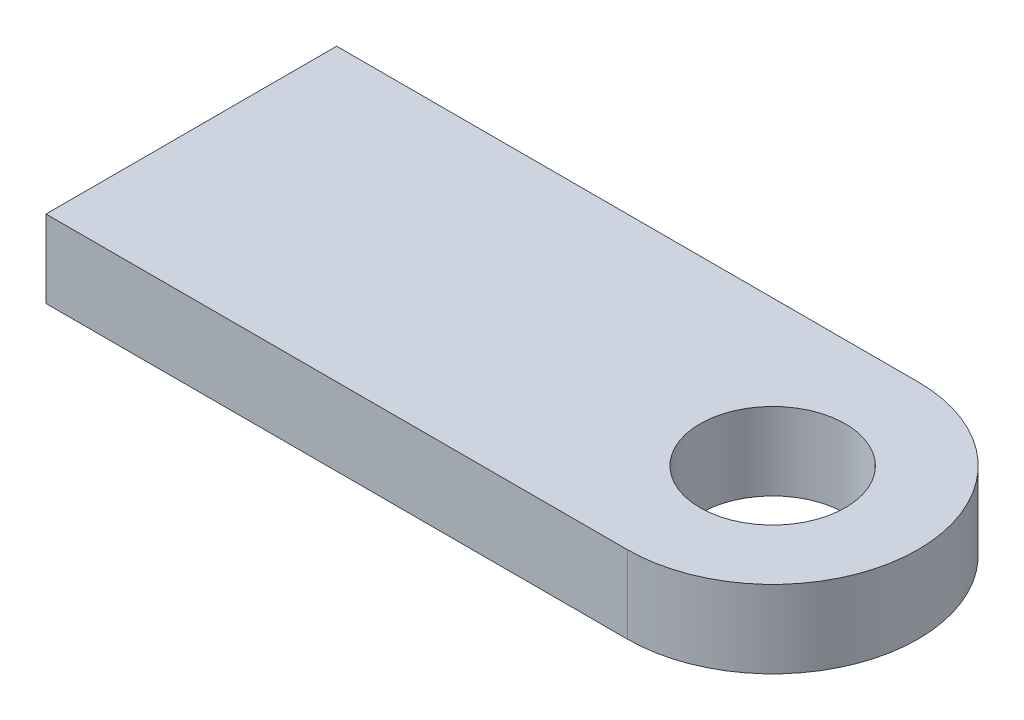
ISO-10303-21;
HEADER;
FILE_DESCRIPTION(('STEP AP214'),'2;1');
FILE_NAME('part.step','',(''),(''),'','','');
FILE_SCHEMA(('AUTOMOTIVE_DESIGN { 1 0 10303 214 1 1 1 1 }'));
ENDSEC;
DATA;
#1=APPLICATION_CONTEXT('core data for automotive mechanical design processes');
#2=APPLICATION_PROTOCOL_DEFINITION('international standard','automotive_design',2000,#1);
#3=PRODUCT_CONTEXT('',#1,'mechanical');
#4=PRODUCT('Part','Part','',(#3));
#5=PRODUCT_RELATED_PRODUCT_CATEGORY('part','',(#4));
#6=PRODUCT_DEFINITION_FORMATION('','',#4);
#7=PRODUCT_DEFINITION_CONTEXT('part definition',#1,'design');
#8=PRODUCT_DEFINITION('design','',#6,#7);
#9=PRODUCT_DEFINITION_SHAPE('','',#8);
#10=(LENGTH_UNIT() NAMED_UNIT(*) SI_UNIT(.MILLI.,.METRE.));
#11=(NAMED_UNIT(*) PLANE_ANGLE_UNIT() SI_UNIT($,.RADIAN.));
#12=(NAMED_UNIT(*) SI_UNIT($,.STERADIAN.) SOLID_ANGLE_UNIT());
#13=UNCERTAINTY_MEASURE_WITH_UNIT(LENGTH_MEASURE(1.E-05),#10,'distance_accuracy_value','');
#14=(GEOMETRIC_REPRESENTATION_CONTEXT(3) GLOBAL_UNCERTAINTY_ASSIGNED_CONTEXT((#13)) GLOBAL_UNIT_ASSIGNED_CONTEXT((#10,
#11,#12)) REPRESENTATION_CONTEXT('',''));
#15=CARTESIAN_POINT('',(0.,0.,0.));
#16=DIRECTION('',(0.,0.,1.));
#17=DIRECTION('',(1.,0.,0.));
#18=AXIS2_PLACEMENT_3D('',#15,#16,#17);
#19=CARTESIAN_POINT('',(0.,2.032,7.62));
#20=DIRECTION('',(1.,0.,0.));
#21=DIRECTION('',(0.,0.,-1.));
#22=AXIS2_PLACEMENT_3D('',#19,#20,#21);
#23=PLANE('',#22);
#24=DIRECTION('',(0.,0.,1.));
#25=VECTOR('',#24,1.);
#26=CARTESIAN_POINT('',(0.,0.,7.62));
#27=LINE('',#26,#25);
#28=CARTESIAN_POINT('',(0.,0.,0.));
#29=VERTEX_POINT('',#28);
#30=CARTESIAN_POINT('',(0.,0.,7.62));
#31=VERTEX_POINT('',#30);
#32=EDGE_CURVE('E96',#29,#31,#27,.T.);
#33=ORIENTED_EDGE('',*,*,#32,.T.);
#34=DIRECTION('',(0.,-1.,0.));
#35=VECTOR('',#34,1.);
#36=CARTESIAN_POINT('',(0.,2.032,7.62));
#37=LINE('',#36,#35);
#38=CARTESIAN_POINT('',(0.,2.032,7.62));
#39=VERTEX_POINT('',#38);
#40=EDGE_CURVE('E11',#39,#31,#37,.T.);
#41=ORIENTED_EDGE('',*,*,#40,.F.);
#42=DIRECTION('',(0.,0.,1.));
#43=VECTOR('',#42,1.);
#44=CARTESIAN_POINT('',(0.,2.032,7.62));
#45=LINE('',#44,#43);
#46=CARTESIAN_POINT('',(0.,2.032,0.));
#47=VERTEX_POINT('',#46);
#48=EDGE_CURVE('E84',#47,#39,#45,.T.);
#49=ORIENTED_EDGE('',*,*,#48,.F.);
#50=DIRECTION('',(0.,-1.,0.));
#51=VECTOR('',#50,1.);
#52=CARTESIAN_POINT('',(0.,2.032,0.));
#53=LINE('',#52,#51);
#54=EDGE_CURVE('E92',#47,#29,#53,.T.);
#55=ORIENTED_EDGE('',*,*,#54,.T.);
#56=EDGE_LOOP('',(#33,#41,#49,#55));
#57=FACE_BOUND('',#56,.T.);
#58=ADVANCED_FACE('F33',(#57),#23,.F.);
#59=CARTESIAN_POINT('',(15.24,2.032,7.62));
#60=DIRECTION('',(0.,0.,-1.));
#61=DIRECTION('',(-1.,0.,0.));
#62=AXIS2_PLACEMENT_3D('',#59,#60,#61);
#63=PLANE('',#62);
#64=DIRECTION('',(1.,0.,0.));
#65=VECTOR('',#64,1.);
#66=CARTESIAN_POINT('',(15.24,0.,7.62));
#67=LINE('',#66,#65);
#68=CARTESIAN_POINT('',(15.24,0.,7.62));
#69=VERTEX_POINT('',#68);
#70=EDGE_CURVE('E88',#31,#69,#67,.T.);
#71=ORIENTED_EDGE('',*,*,#70,.T.);
#72=DIRECTION('',(0.,-1.,0.));
#73=VECTOR('',#72,1.);
#74=CARTESIAN_POINT('',(15.24,2.032,7.62));
#75=LINE('',#74,#73);
#76=CARTESIAN_POINT('',(15.24,2.032,7.62));
#77=VERTEX_POINT('',#76);
#78=EDGE_CURVE('E41',#77,#69,#75,.T.);
#79=ORIENTED_EDGE('',*,*,#78,.F.);
#80=DIRECTION('',(1.,0.,0.));
#81=VECTOR('',#80,1.);
#82=CARTESIAN_POINT('',(15.24,2.032,7.62));
#83=LINE('',#82,#81);
#84=EDGE_CURVE('E79',#39,#77,#83,.T.);
#85=ORIENTED_EDGE('',*,*,#84,.F.);
#86=ORIENTED_EDGE('',*,*,#40,.T.);
#87=EDGE_LOOP('',(#71,#79,#85,#86));
#88=FACE_BOUND('',#87,.T.);
#89=ADVANCED_FACE('F87',(#88),#63,.F.);
#90=CARTESIAN_POINT('',(15.24,2.032,3.81));
#91=DIRECTION('',(0.,-1.,0.));
#92=DIRECTION('',(0.,0.,-1.));
#93=AXIS2_PLACEMENT_3D('',#90,#91,#92);
#94=CYLINDRICAL_SURFACE('',#93,3.81);
#95=CARTESIAN_POINT('',(15.24,0.,3.81));
#96=DIRECTION('',(0.,1.,0.));
#97=DIRECTION('',(0.,0.,-1.));
#98=AXIS2_PLACEMENT_3D('',#95,#96,#97);
#99=CIRCLE('',#98,3.81);
#100=CARTESIAN_POINT('',(15.24,0.,0.));
#101=VERTEX_POINT('',#100);
#102=EDGE_CURVE('E66',#69,#101,#99,.T.);
#103=ORIENTED_EDGE('',*,*,#102,.T.);
#104=DIRECTION('',(0.,-1.,0.));
#105=VECTOR('',#104,1.);
#106=CARTESIAN_POINT('',(15.24,2.032,0.));
#107=LINE('',#106,#105);
#108=CARTESIAN_POINT('',(15.24,2.032,0.));
#109=VERTEX_POINT('',#108);
#110=EDGE_CURVE('E89',#109,#101,#107,.T.);
#111=ORIENTED_EDGE('',*,*,#110,.F.);
#112=CARTESIAN_POINT('',(15.24,2.032,3.81));
#113=DIRECTION('',(0.,1.,0.));
#114=DIRECTION('',(0.,0.,-1.));
#115=AXIS2_PLACEMENT_3D('',#112,#113,#114);
#116=CIRCLE('',#115,3.81);
#117=EDGE_CURVE('E82',#77,#109,#116,.T.);
#118=ORIENTED_EDGE('',*,*,#117,.F.);
#119=ORIENTED_EDGE('',*,*,#78,.T.);
#120=EDGE_LOOP('',(#103,#111,#118,#119));
#121=FACE_BOUND('',#120,.T.);
#122=ADVANCED_FACE('F90',(#121),#94,.T.);
#123=CARTESIAN_POINT('',(0.,2.032,0.));
#124=DIRECTION('',(0.,0.,1.));
#125=DIRECTION('',(1.,0.,0.));
#126=AXIS2_PLACEMENT_3D('',#123,#124,#125);
#127=PLANE('',#126);
#128=DIRECTION('',(-1.,0.,0.));
#129=VECTOR('',#128,1.);
#130=CARTESIAN_POINT('',(0.,0.,0.));
#131=LINE('',#130,#129);
#132=EDGE_CURVE('E72',#101,#29,#131,.T.);
#133=ORIENTED_EDGE('',*,*,#132,.T.);
#134=ORIENTED_EDGE('',*,*,#54,.F.);
#135=DIRECTION('',(-1.,0.,0.));
#136=VECTOR('',#135,1.);
#137=CARTESIAN_POINT('',(0.,2.032,0.));
#138=LINE('',#137,#136);
#139=EDGE_CURVE('E49',#109,#47,#138,.T.);
#140=ORIENTED_EDGE('',*,*,#139,.F.);
#141=ORIENTED_EDGE('',*,*,#110,.T.);
#142=EDGE_LOOP('',(#133,#134,#140,#141));
#143=FACE_BOUND('',#142,.T.);
#144=ADVANCED_FACE('F104',(#143),#127,.F.);
#145=CARTESIAN_POINT('',(15.24,2.032,3.81));
#146=DIRECTION('',(0.,-1.,0.));
#147=DIRECTION('',(0.,0.,-1.));
#148=AXIS2_PLACEMENT_3D('',#145,#146,#147);
#149=PLANE('',#148);
#150=CARTESIAN_POINT('',(15.24,2.032,3.81));
#151=DIRECTION('',(0.,1.,0.));
#152=DIRECTION('',(0.,0.,1.));
#153=AXIS2_PLACEMENT_3D('',#150,#151,#152);
#154=CIRCLE('',#153,1.90500000000001);
#155=CARTESIAN_POINT('',(15.24,2.032,5.71500000000001));
#156=VERTEX_POINT('',#155);
#157=EDGE_CURVE('E110',#156,#156,#154,.T.);
#158=ORIENTED_EDGE('',*,*,#157,.F.);
#159=EDGE_LOOP('',(#158));
#160=FACE_BOUND('',#159,.T.);
#161=ORIENTED_EDGE('',*,*,#48,.T.);
#162=ORIENTED_EDGE('',*,*,#84,.T.);
#163=ORIENTED_EDGE('',*,*,#117,.T.);
#164=ORIENTED_EDGE('',*,*,#139,.T.);
#165=EDGE_LOOP('',(#161,#162,#163,#164));
#166=FACE_BOUND('',#165,.T.);
#167=ADVANCED_FACE('F80',(#160,#166),#149,.F.);
#168=CARTESIAN_POINT('',(15.24,0.,3.81));
#169=DIRECTION('',(0.,-1.,0.));
#170=DIRECTION('',(0.,0.,-1.));
#171=AXIS2_PLACEMENT_3D('',#168,#169,#170);
#172=PLANE('',#171);
#173=CARTESIAN_POINT('',(15.24,0.,3.81));
#174=DIRECTION('',(0.,1.,0.));
#175=DIRECTION('',(0.,0.,1.));
#176=AXIS2_PLACEMENT_3D('',#173,#174,#175);
#177=CIRCLE('',#176,1.90500000000001);
#178=CARTESIAN_POINT('',(15.24,0.,5.71500000000001));
#179=VERTEX_POINT('',#178);
#180=EDGE_CURVE('E99',#179,#179,#177,.T.);
#181=ORIENTED_EDGE('',*,*,#180,.T.);
#182=EDGE_LOOP('',(#181));
#183=FACE_BOUND('',#182,.T.);
#184=ORIENTED_EDGE('',*,*,#32,.F.);
#185=ORIENTED_EDGE('',*,*,#132,.F.);
#186=ORIENTED_EDGE('',*,*,#102,.F.);
#187=ORIENTED_EDGE('',*,*,#70,.F.);
#188=EDGE_LOOP('',(#184,#185,#186,#187));
#189=FACE_BOUND('',#188,.T.);
#190=ADVANCED_FACE('F107',(#183,#189),#172,.T.);
#191=CARTESIAN_POINT('',(15.24,0.,3.81));
#192=DIRECTION('',(0.,1.,0.));
#193=DIRECTION('',(0.,0.,1.));
#194=AXIS2_PLACEMENT_3D('',#191,#192,#193);
#195=CYLINDRICAL_SURFACE('',#194,1.90500000000001);
#196=ORIENTED_EDGE('',*,*,#180,.F.);
#197=EDGE_LOOP('',(#196));
#198=FACE_BOUND('',#197,.T.);
#199=ORIENTED_EDGE('',*,*,#157,.T.);
#200=EDGE_LOOP('',(#199));
#201=FACE_BOUND('',#200,.T.);
#202=ADVANCED_FACE('F117',(#198,#201),#195,.F.);
#203=CLOSED_SHELL('',(#58,#89,#122,#144,#167,#190,#202));
#204=MANIFOLD_SOLID_BREP('B2',#203);
#205=ADVANCED_BREP_SHAPE_REPRESENTATION('',(#18,#204),#14);
#206=SHAPE_DEFINITION_REPRESENTATION(#9,#205);
ENDSEC;
END-ISO-10303-21;
